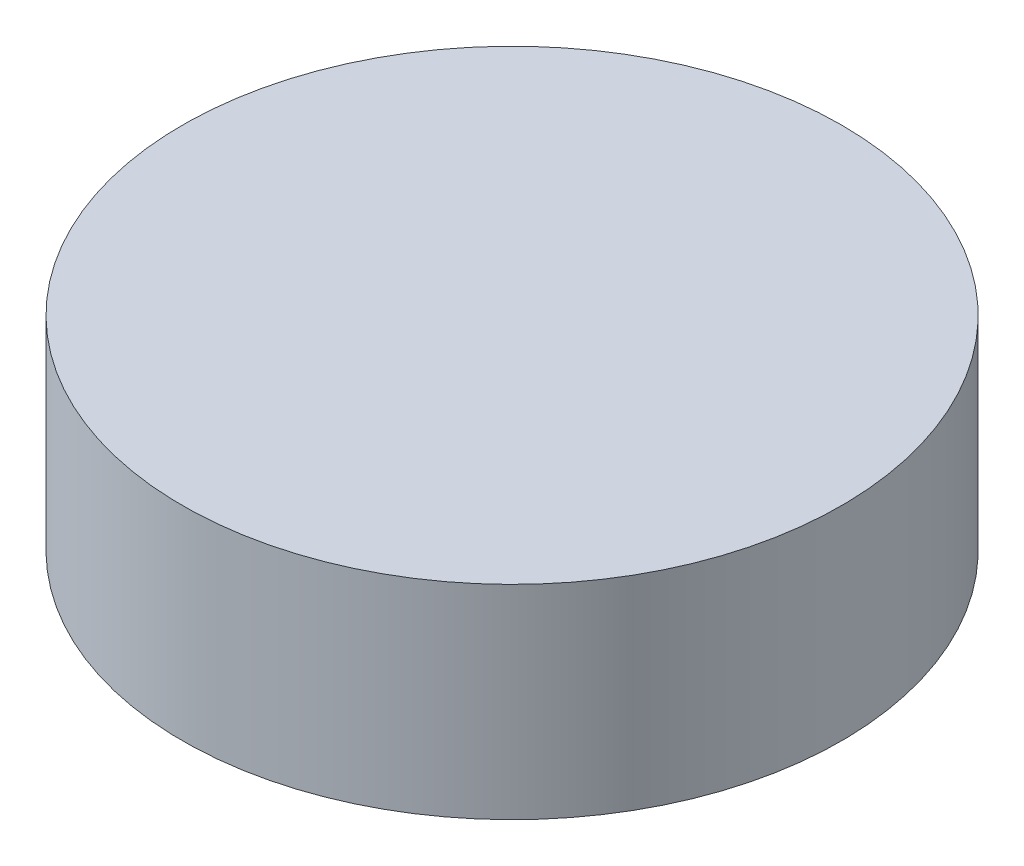
ISO-10303-21;
HEADER;
FILE_DESCRIPTION(('STEP AP214'),'2;1');
FILE_NAME('part.step','',(''),(''),'','','');
FILE_SCHEMA(('AUTOMOTIVE_DESIGN { 1 0 10303 214 1 1 1 1 }'));
ENDSEC;
DATA;
#1=APPLICATION_CONTEXT('core data for automotive mechanical design processes');
#2=APPLICATION_PROTOCOL_DEFINITION('international standard','automotive_design',2000,#1);
#3=PRODUCT_CONTEXT('',#1,'mechanical');
#4=PRODUCT('Part','Part','',(#3));
#5=PRODUCT_RELATED_PRODUCT_CATEGORY('part','',(#4));
#6=PRODUCT_DEFINITION_FORMATION('','',#4);
#7=PRODUCT_DEFINITION_CONTEXT('part definition',#1,'design');
#8=PRODUCT_DEFINITION('design','',#6,#7);
#9=PRODUCT_DEFINITION_SHAPE('','',#8);
#10=(LENGTH_UNIT() NAMED_UNIT(*) SI_UNIT(.MILLI.,.METRE.));
#11=(NAMED_UNIT(*) PLANE_ANGLE_UNIT() SI_UNIT($,.RADIAN.));
#12=(NAMED_UNIT(*) SI_UNIT($,.STERADIAN.) SOLID_ANGLE_UNIT());
#13=UNCERTAINTY_MEASURE_WITH_UNIT(LENGTH_MEASURE(1.E-05),#10,'distance_accuracy_value','');
#14=(GEOMETRIC_REPRESENTATION_CONTEXT(3) GLOBAL_UNCERTAINTY_ASSIGNED_CONTEXT((#13)) GLOBAL_UNIT_ASSIGNED_CONTEXT((#10,
#11,#12)) REPRESENTATION_CONTEXT('',''));
#15=CARTESIAN_POINT('',(0.,0.,0.));
#16=DIRECTION('',(0.,0.,1.));
#17=DIRECTION('',(1.,0.,0.));
#18=AXIS2_PLACEMENT_3D('',#15,#16,#17);
#19=CARTESIAN_POINT('',(0.,19.05,0.));
#20=DIRECTION('',(0.,-1.,0.));
#21=DIRECTION('',(0.,0.,-1.));
#22=AXIS2_PLACEMENT_3D('',#19,#20,#21);
#23=CYLINDRICAL_SURFACE('',#22,61.6204);
#24=CARTESIAN_POINT('',(0.,19.05,0.));
#25=DIRECTION('',(0.,1.,0.));
#26=DIRECTION('',(0.,0.,1.));
#27=AXIS2_PLACEMENT_3D('',#24,#25,#26);
#28=CIRCLE('',#27,61.6204);
#29=CARTESIAN_POINT('',(0.,19.05,-61.6204));
#30=VERTEX_POINT('',#29);
#31=EDGE_CURVE('E10',#30,#30,#28,.T.);
#32=CARTESIAN_POINT('',(0.,-19.05,0.));
#33=DIRECTION('',(0.,1.,0.));
#34=DIRECTION('',(0.,0.,1.));
#35=AXIS2_PLACEMENT_3D('',#32,#33,#34);
#36=CIRCLE('',#35,61.6204);
#37=CARTESIAN_POINT('',(0.,-19.05,-61.6204));
#38=VERTEX_POINT('',#37);
#39=EDGE_CURVE('E40',#38,#38,#36,.T.);
#40=CARTESIAN_POINT('',(0.,19.05,-61.6204));
#41=CARTESIAN_POINT('',(0.,18.653125,-61.6204));
#42=CARTESIAN_POINT('',(0.,18.25625,-61.6204));
#43=CARTESIAN_POINT('',(0.,17.4625,-61.6204));
#44=CARTESIAN_POINT('',(0.,17.065625,-61.6204));
#45=CARTESIAN_POINT('',(0.,16.271875,-61.6204));
#46=CARTESIAN_POINT('',(0.,15.875,-61.6204));
#47=CARTESIAN_POINT('',(0.,15.08125,-61.6204));
#48=CARTESIAN_POINT('',(0.,14.684375,-61.6204));
#49=CARTESIAN_POINT('',(0.,13.890625,-61.6204));
#50=CARTESIAN_POINT('',(0.,13.49375,-61.6204));
#51=CARTESIAN_POINT('',(0.,12.7,-61.6204));
#52=CARTESIAN_POINT('',(0.,12.303125,-61.6204));
#53=CARTESIAN_POINT('',(0.,11.509375,-61.6204));
#54=CARTESIAN_POINT('',(0.,11.1125,-61.6204));
#55=CARTESIAN_POINT('',(0.,10.31875,-61.6204));
#56=CARTESIAN_POINT('',(0.,9.921875,-61.6204));
#57=CARTESIAN_POINT('',(0.,9.128125,-61.6204));
#58=CARTESIAN_POINT('',(0.,8.73125,-61.6204));
#59=CARTESIAN_POINT('',(0.,7.9375,-61.6204));
#60=CARTESIAN_POINT('',(0.,7.540625,-61.6204));
#61=CARTESIAN_POINT('',(0.,6.746875,-61.6204));
#62=CARTESIAN_POINT('',(0.,6.35,-61.6204));
#63=CARTESIAN_POINT('',(0.,5.55625,-61.6204));
#64=CARTESIAN_POINT('',(0.,5.159375,-61.6204));
#65=CARTESIAN_POINT('',(0.,4.365625,-61.6204));
#66=CARTESIAN_POINT('',(0.,3.96875,-61.6204));
#67=CARTESIAN_POINT('',(0.,3.175,-61.6204));
#68=CARTESIAN_POINT('',(0.,2.778125,-61.6204));
#69=CARTESIAN_POINT('',(0.,1.984375,-61.6204));
#70=CARTESIAN_POINT('',(0.,1.5875,-61.6204));
#71=CARTESIAN_POINT('',(0.,0.793749999999997,-61.6204));
#72=CARTESIAN_POINT('',(0.,0.396874999999997,-61.6204));
#73=CARTESIAN_POINT('',(0.,-0.396875000000004,-61.6204));
#74=CARTESIAN_POINT('',(0.,-0.793750000000004,-61.6204));
#75=CARTESIAN_POINT('',(0.,-1.5875,-61.6204));
#76=CARTESIAN_POINT('',(0.,-1.984375,-61.6204));
#77=CARTESIAN_POINT('',(0.,-2.77812500000001,-61.6204));
#78=CARTESIAN_POINT('',(0.,-3.17500000000001,-61.6204));
#79=CARTESIAN_POINT('',(0.,-3.96875000000001,-61.6204));
#80=CARTESIAN_POINT('',(0.,-4.36562500000001,-61.6204));
#81=CARTESIAN_POINT('',(0.,-5.15937500000001,-61.6204));
#82=CARTESIAN_POINT('',(0.,-5.55625,-61.6204));
#83=CARTESIAN_POINT('',(0.,-6.35,-61.6204));
#84=CARTESIAN_POINT('',(0.,-6.746875,-61.6204));
#85=CARTESIAN_POINT('',(0.,-7.540625,-61.6204));
#86=CARTESIAN_POINT('',(0.,-7.93750000000001,-61.6204));
#87=CARTESIAN_POINT('',(0.,-8.73125,-61.6204));
#88=CARTESIAN_POINT('',(0.,-9.12812500000001,-61.6204));
#89=CARTESIAN_POINT('',(0.,-9.92187500000001,-61.6204));
#90=CARTESIAN_POINT('',(0.,-10.31875,-61.6204));
#91=CARTESIAN_POINT('',(0.,-11.1125,-61.6204));
#92=CARTESIAN_POINT('',(0.,-11.509375,-61.6204));
#93=CARTESIAN_POINT('',(0.,-12.303125,-61.6204));
#94=CARTESIAN_POINT('',(0.,-12.7,-61.6204));
#95=CARTESIAN_POINT('',(0.,-13.49375,-61.6204));
#96=CARTESIAN_POINT('',(0.,-13.890625,-61.6204));
#97=CARTESIAN_POINT('',(0.,-14.684375,-61.6204));
#98=CARTESIAN_POINT('',(0.,-15.08125,-61.6204));
#99=CARTESIAN_POINT('',(0.,-15.875,-61.6204));
#100=CARTESIAN_POINT('',(0.,-16.271875,-61.6204));
#101=CARTESIAN_POINT('',(0.,-17.065625,-61.6204));
#102=CARTESIAN_POINT('',(0.,-17.4625,-61.6204));
#103=CARTESIAN_POINT('',(0.,-18.25625,-61.6204));
#104=CARTESIAN_POINT('',(0.,-18.653125,-61.6204));
#105=CARTESIAN_POINT('',(0.,-19.05,-61.6204));
#106=B_SPLINE_CURVE_WITH_KNOTS('',3,(#40,#41,#42,#43,#44,#45,#46,#47,#48,#49,#50,#51,#52,#53,
#54,#55,#56,#57,#58,#59,#60,#61,#62,#63,#64,#65,#66,#67,#68,#69,#70,#71,#72,#73,#74,#75,#76,#77,
#78,#79,#80,#81,#82,#83,#84,#85,#86,#87,#88,#89,#90,#91,#92,#93,#94,#95,#96,#97,#98,#99,#100,
#101,#102,#103,#104,#105),.UNSPECIFIED.,.F.,.F.,(4,2,2,2,2,2,2,2,2,2,2,2,2,2,2,2,2,2,2,2,2,2,2,
2,2,2,2,2,2,2,2,2,4),(0.,1.190625,2.38125,3.571875,4.7625,5.953125,7.14375,8.334375,9.525,
10.715625,11.90625,13.096875,14.2875,15.478125,16.66875,17.859375,19.05,20.240625,21.43125,
22.621875,23.8125,25.003125,26.19375,27.384375,28.575,29.765625,30.95625,32.146875,33.3375,
34.528125,35.71875,36.909375,38.1),.UNSPECIFIED.);
#107=EDGE_CURVE('BSEAM37',#30,#38,#106,.T.);
#108=ORIENTED_EDGE('',*,*,#31,.F.);
#109=ORIENTED_EDGE('',*,*,#39,.T.);
#110=ORIENTED_EDGE('',*,*,#107,.T.);
#111=ORIENTED_EDGE('',*,*,#107,.F.);
#112=EDGE_LOOP('',(#108,#110,#109,#111));
#113=FACE_BOUND('',#112,.T.);
#114=ADVANCED_FACE('F37',(#113),#23,.T.);
#115=CARTESIAN_POINT('',(0.,19.05,0.));
#116=DIRECTION('',(0.,1.,0.));
#117=DIRECTION('',(0.,0.,1.));
#118=AXIS2_PLACEMENT_3D('',#115,#116,#117);
#119=PLANE('',#118);
#120=ORIENTED_EDGE('',*,*,#31,.T.);
#121=EDGE_LOOP('',(#120));
#122=FACE_BOUND('',#121,.T.);
#123=ADVANCED_FACE('F54',(#122),#119,.T.);
#124=CARTESIAN_POINT('',(0.,-19.05,0.));
#125=DIRECTION('',(0.,1.,0.));
#126=DIRECTION('',(0.,0.,1.));
#127=AXIS2_PLACEMENT_3D('',#124,#125,#126);
#128=PLANE('',#127);
#129=ORIENTED_EDGE('',*,*,#39,.F.);
#130=EDGE_LOOP('',(#129));
#131=FACE_BOUND('',#130,.T.);
#132=ADVANCED_FACE('F52',(#131),#128,.F.);
#133=CLOSED_SHELL('',(#114,#123,#132));
#134=MANIFOLD_SOLID_BREP('B2',#133);
#135=ADVANCED_BREP_SHAPE_REPRESENTATION('',(#18,#134),#14);
#136=SHAPE_DEFINITION_REPRESENTATION(#9,#135);
ENDSEC;
END-ISO-10303-21;
